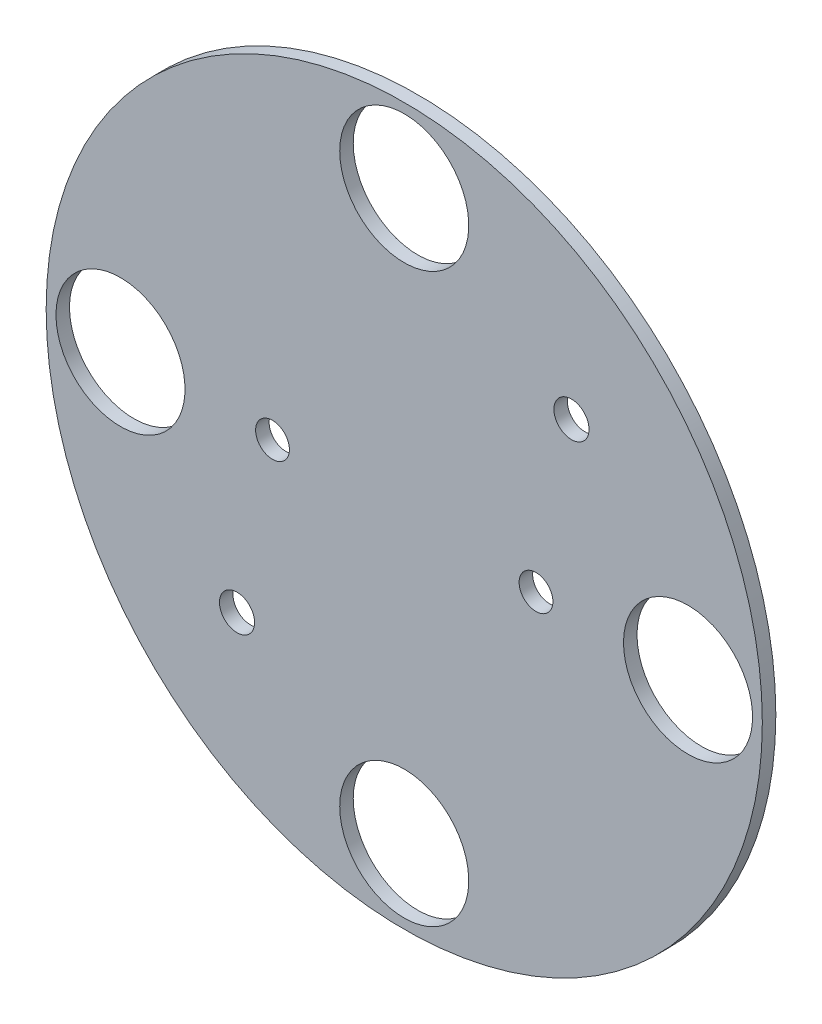
ISO-10303-21;
HEADER;
FILE_DESCRIPTION(('STEP AP214'),'2;1');
FILE_NAME('part.step','',(''),(''),'','','');
FILE_SCHEMA(('AUTOMOTIVE_DESIGN { 1 0 10303 214 1 1 1 1 }'));
ENDSEC;
DATA;
#1=APPLICATION_CONTEXT('core data for automotive mechanical design processes');
#2=APPLICATION_PROTOCOL_DEFINITION('international standard','automotive_design',2000,#1);
#3=PRODUCT_CONTEXT('',#1,'mechanical');
#4=PRODUCT('Part','Part','',(#3));
#5=PRODUCT_RELATED_PRODUCT_CATEGORY('part','',(#4));
#6=PRODUCT_DEFINITION_FORMATION('','',#4);
#7=PRODUCT_DEFINITION_CONTEXT('part definition',#1,'design');
#8=PRODUCT_DEFINITION('design','',#6,#7);
#9=PRODUCT_DEFINITION_SHAPE('','',#8);
#10=(LENGTH_UNIT() NAMED_UNIT(*) SI_UNIT(.MILLI.,.METRE.));
#11=(NAMED_UNIT(*) PLANE_ANGLE_UNIT() SI_UNIT($,.RADIAN.));
#12=(NAMED_UNIT(*) SI_UNIT($,.STERADIAN.) SOLID_ANGLE_UNIT());
#13=UNCERTAINTY_MEASURE_WITH_UNIT(LENGTH_MEASURE(1.E-05),#10,'distance_accuracy_value','');
#14=(GEOMETRIC_REPRESENTATION_CONTEXT(3) GLOBAL_UNCERTAINTY_ASSIGNED_CONTEXT((#13)) GLOBAL_UNIT_ASSIGNED_CONTEXT((#10,
#11,#12)) REPRESENTATION_CONTEXT('',''));
#15=CARTESIAN_POINT('',(0.,0.,0.));
#16=DIRECTION('',(0.,0.,1.));
#17=DIRECTION('',(1.,0.,0.));
#18=AXIS2_PLACEMENT_3D('',#15,#16,#17);
#19=CARTESIAN_POINT('',(-19.5,0.,2.));
#20=DIRECTION('',(0.,0.,-1.));
#21=DIRECTION('',(-1.,0.,0.));
#22=AXIS2_PLACEMENT_3D('',#19,#20,#21);
#23=CYLINDRICAL_SURFACE('',#22,2.5);
#24=CARTESIAN_POINT('',(-19.5,0.,2.));
#25=DIRECTION('',(0.,0.,-1.));
#26=DIRECTION('',(-1.,0.,0.));
#27=AXIS2_PLACEMENT_3D('',#24,#25,#26);
#28=CIRCLE('',#27,2.5);
#29=CARTESIAN_POINT('',(-17.,0.,2.));
#30=VERTEX_POINT('',#29);
#31=EDGE_CURVE('E108',#30,#30,#28,.T.);
#32=ORIENTED_EDGE('',*,*,#31,.F.);
#33=DIRECTION('',(0.,0.,-1.));
#34=VECTOR('',#33,1.);
#35=CARTESIAN_POINT('',(-17.,0.,2.));
#36=LINE('',#35,#34);
#37=CARTESIAN_POINT('',(-17.,0.,0.));
#38=VERTEX_POINT('',#37);
#39=EDGE_CURVE('E11',#30,#38,#36,.T.);
#40=ORIENTED_EDGE('',*,*,#39,.T.);
#41=CARTESIAN_POINT('',(-19.5,0.,0.));
#42=DIRECTION('',(0.,0.,-1.));
#43=DIRECTION('',(-1.,0.,0.));
#44=AXIS2_PLACEMENT_3D('',#41,#42,#43);
#45=CIRCLE('',#44,2.5);
#46=EDGE_CURVE('E137',#38,#38,#45,.T.);
#47=ORIENTED_EDGE('',*,*,#46,.T.);
#48=ORIENTED_EDGE('',*,*,#39,.F.);
#49=EDGE_LOOP('',(#32,#40,#47,#48));
#50=FACE_BOUND('',#49,.T.);
#51=ADVANCED_FACE('F17',(#50),#23,.F.);
#52=CARTESIAN_POINT('',(19.5,0.,2.));
#53=DIRECTION('',(0.,0.,-1.));
#54=DIRECTION('',(-1.,0.,0.));
#55=AXIS2_PLACEMENT_3D('',#52,#53,#54);
#56=CYLINDRICAL_SURFACE('',#55,2.5);
#57=CARTESIAN_POINT('',(19.5,0.,2.));
#58=DIRECTION('',(0.,0.,-1.));
#59=DIRECTION('',(-1.,0.,0.));
#60=AXIS2_PLACEMENT_3D('',#57,#58,#59);
#61=CIRCLE('',#60,2.5);
#62=CARTESIAN_POINT('',(22.,0.,2.));
#63=VERTEX_POINT('',#62);
#64=EDGE_CURVE('E21',#63,#63,#61,.T.);
#65=ORIENTED_EDGE('',*,*,#64,.F.);
#66=DIRECTION('',(0.,0.,-1.));
#67=VECTOR('',#66,1.);
#68=CARTESIAN_POINT('',(22.,0.,2.));
#69=LINE('',#68,#67);
#70=CARTESIAN_POINT('',(22.,0.,0.));
#71=VERTEX_POINT('',#70);
#72=EDGE_CURVE('E28',#63,#71,#69,.T.);
#73=ORIENTED_EDGE('',*,*,#72,.T.);
#74=CARTESIAN_POINT('',(19.5,0.,0.));
#75=DIRECTION('',(0.,0.,-1.));
#76=DIRECTION('',(-1.,0.,0.));
#77=AXIS2_PLACEMENT_3D('',#74,#75,#76);
#78=CIRCLE('',#77,2.5);
#79=EDGE_CURVE('E229',#71,#71,#78,.T.);
#80=ORIENTED_EDGE('',*,*,#79,.T.);
#81=ORIENTED_EDGE('',*,*,#72,.F.);
#82=EDGE_LOOP('',(#65,#73,#80,#81));
#83=FACE_BOUND('',#82,.T.);
#84=ADVANCED_FACE('F167',(#83),#56,.F.);
#85=CARTESIAN_POINT('',(-24.74873734153,-24.74873734153,2.));
#86=DIRECTION('',(0.,0.,-1.));
#87=DIRECTION('',(-1.,0.,0.));
#88=AXIS2_PLACEMENT_3D('',#85,#86,#87);
#89=CYLINDRICAL_SURFACE('',#88,2.6);
#90=CARTESIAN_POINT('',(-24.74873734153,-24.74873734153,2.));
#91=DIRECTION('',(0.,0.,-1.));
#92=DIRECTION('',(-1.,0.,0.));
#93=AXIS2_PLACEMENT_3D('',#90,#91,#92);
#94=CIRCLE('',#93,2.6);
#95=CARTESIAN_POINT('',(-22.14873734153,-24.74873734153,2.));
#96=VERTEX_POINT('',#95);
#97=EDGE_CURVE('E141',#96,#96,#94,.T.);
#98=ORIENTED_EDGE('',*,*,#97,.F.);
#99=DIRECTION('',(0.,0.,-1.));
#100=VECTOR('',#99,1.);
#101=CARTESIAN_POINT('',(-22.14873734153,-24.74873734153,2.));
#102=LINE('',#101,#100);
#103=CARTESIAN_POINT('',(-22.14873734153,-24.74873734153,0.));
#104=VERTEX_POINT('',#103);
#105=EDGE_CURVE('E235',#96,#104,#102,.T.);
#106=ORIENTED_EDGE('',*,*,#105,.T.);
#107=CARTESIAN_POINT('',(-24.74873734153,-24.74873734153,0.));
#108=DIRECTION('',(0.,0.,-1.));
#109=DIRECTION('',(-1.,0.,0.));
#110=AXIS2_PLACEMENT_3D('',#107,#108,#109);
#111=CIRCLE('',#110,2.6);
#112=EDGE_CURVE('E222',#104,#104,#111,.T.);
#113=ORIENTED_EDGE('',*,*,#112,.T.);
#114=ORIENTED_EDGE('',*,*,#105,.F.);
#115=EDGE_LOOP('',(#98,#106,#113,#114));
#116=FACE_BOUND('',#115,.T.);
#117=ADVANCED_FACE('F19',(#116),#89,.F.);
#118=CARTESIAN_POINT('',(24.74873734153,24.74873734153,2.));
#119=DIRECTION('',(0.,0.,-1.));
#120=DIRECTION('',(-1.,0.,0.));
#121=AXIS2_PLACEMENT_3D('',#118,#119,#120);
#122=CYLINDRICAL_SURFACE('',#121,2.6);
#123=CARTESIAN_POINT('',(24.74873734153,24.74873734153,2.));
#124=DIRECTION('',(0.,0.,-1.));
#125=DIRECTION('',(-1.,0.,0.));
#126=AXIS2_PLACEMENT_3D('',#123,#124,#125);
#127=CIRCLE('',#126,2.6);
#128=CARTESIAN_POINT('',(27.34873734153,24.74873734153,2.));
#129=VERTEX_POINT('',#128);
#130=EDGE_CURVE('E126',#129,#129,#127,.T.);
#131=ORIENTED_EDGE('',*,*,#130,.F.);
#132=DIRECTION('',(0.,0.,-1.));
#133=VECTOR('',#132,1.);
#134=CARTESIAN_POINT('',(27.34873734153,24.74873734153,2.));
#135=LINE('',#134,#133);
#136=CARTESIAN_POINT('',(27.34873734153,24.74873734153,0.));
#137=VERTEX_POINT('',#136);
#138=EDGE_CURVE('E197',#129,#137,#135,.T.);
#139=ORIENTED_EDGE('',*,*,#138,.T.);
#140=CARTESIAN_POINT('',(24.74873734153,24.74873734153,0.));
#141=DIRECTION('',(0.,0.,-1.));
#142=DIRECTION('',(-1.,0.,0.));
#143=AXIS2_PLACEMENT_3D('',#140,#141,#142);
#144=CIRCLE('',#143,2.6);
#145=EDGE_CURVE('E219',#137,#137,#144,.T.);
#146=ORIENTED_EDGE('',*,*,#145,.T.);
#147=ORIENTED_EDGE('',*,*,#138,.F.);
#148=EDGE_LOOP('',(#131,#139,#146,#147));
#149=FACE_BOUND('',#148,.T.);
#150=ADVANCED_FACE('F185',(#149),#122,.F.);
#151=CARTESIAN_POINT('',(-42.,0.,0.));
#152=DIRECTION('',(0.,0.,1.));
#153=DIRECTION('',(1.,0.,0.));
#154=AXIS2_PLACEMENT_3D('',#151,#152,#153);
#155=CYLINDRICAL_SURFACE('',#154,9.55);
#156=CARTESIAN_POINT('',(-42.,0.,0.));
#157=DIRECTION('',(0.,0.,-1.));
#158=DIRECTION('',(1.,0.,0.));
#159=AXIS2_PLACEMENT_3D('',#156,#157,#158);
#160=CIRCLE('',#159,9.55);
#161=CARTESIAN_POINT('',(-51.55,0.,0.));
#162=VERTEX_POINT('',#161);
#163=EDGE_CURVE('E120',#162,#162,#160,.T.);
#164=ORIENTED_EDGE('',*,*,#163,.T.);
#165=DIRECTION('',(0.,0.,1.));
#166=VECTOR('',#165,1.);
#167=CARTESIAN_POINT('',(-51.55,0.,0.));
#168=LINE('',#167,#166);
#169=CARTESIAN_POINT('',(-51.55,0.,2.));
#170=VERTEX_POINT('',#169);
#171=EDGE_CURVE('E144',#162,#170,#168,.T.);
#172=ORIENTED_EDGE('',*,*,#171,.T.);
#173=CARTESIAN_POINT('',(-42.,0.,2.));
#174=DIRECTION('',(0.,0.,-1.));
#175=DIRECTION('',(1.,0.,0.));
#176=AXIS2_PLACEMENT_3D('',#173,#174,#175);
#177=CIRCLE('',#176,9.55);
#178=EDGE_CURVE('E122',#170,#170,#177,.T.);
#179=ORIENTED_EDGE('',*,*,#178,.F.);
#180=ORIENTED_EDGE('',*,*,#171,.F.);
#181=EDGE_LOOP('',(#164,#172,#179,#180));
#182=FACE_BOUND('',#181,.T.);
#183=ADVANCED_FACE('F176',(#182),#155,.F.);
#184=CARTESIAN_POINT('',(0.,-42.,0.));
#185=DIRECTION('',(0.,0.,1.));
#186=DIRECTION('',(1.,0.,0.));
#187=AXIS2_PLACEMENT_3D('',#184,#185,#186);
#188=CYLINDRICAL_SURFACE('',#187,9.55);
#189=CARTESIAN_POINT('',(0.,-42.,0.));
#190=DIRECTION('',(0.,0.,-1.));
#191=DIRECTION('',(1.,0.,0.));
#192=AXIS2_PLACEMENT_3D('',#189,#190,#191);
#193=CIRCLE('',#192,9.55);
#194=CARTESIAN_POINT('',(-9.55,-42.,0.));
#195=VERTEX_POINT('',#194);
#196=EDGE_CURVE('E223',#195,#195,#193,.T.);
#197=ORIENTED_EDGE('',*,*,#196,.T.);
#198=DIRECTION('',(0.,0.,1.));
#199=VECTOR('',#198,1.);
#200=CARTESIAN_POINT('',(-9.55,-42.,0.));
#201=LINE('',#200,#199);
#202=CARTESIAN_POINT('',(-9.55,-42.,2.));
#203=VERTEX_POINT('',#202);
#204=EDGE_CURVE('E116',#195,#203,#201,.T.);
#205=ORIENTED_EDGE('',*,*,#204,.T.);
#206=CARTESIAN_POINT('',(0.,-42.,2.));
#207=DIRECTION('',(0.,0.,-1.));
#208=DIRECTION('',(1.,0.,0.));
#209=AXIS2_PLACEMENT_3D('',#206,#207,#208);
#210=CIRCLE('',#209,9.55);
#211=EDGE_CURVE('E127',#203,#203,#210,.T.);
#212=ORIENTED_EDGE('',*,*,#211,.F.);
#213=ORIENTED_EDGE('',*,*,#204,.F.);
#214=EDGE_LOOP('',(#197,#205,#212,#213));
#215=FACE_BOUND('',#214,.T.);
#216=ADVANCED_FACE('F183',(#215),#188,.F.);
#217=CARTESIAN_POINT('',(42.,0.,0.));
#218=DIRECTION('',(0.,0.,1.));
#219=DIRECTION('',(1.,0.,0.));
#220=AXIS2_PLACEMENT_3D('',#217,#218,#219);
#221=CYLINDRICAL_SURFACE('',#220,9.55);
#222=CARTESIAN_POINT('',(42.,0.,0.));
#223=DIRECTION('',(0.,0.,-1.));
#224=DIRECTION('',(1.,0.,0.));
#225=AXIS2_PLACEMENT_3D('',#222,#223,#224);
#226=CIRCLE('',#225,9.55);
#227=CARTESIAN_POINT('',(32.45,0.,0.));
#228=VERTEX_POINT('',#227);
#229=EDGE_CURVE('E129',#228,#228,#226,.T.);
#230=ORIENTED_EDGE('',*,*,#229,.T.);
#231=DIRECTION('',(0.,0.,1.));
#232=VECTOR('',#231,1.);
#233=CARTESIAN_POINT('',(32.45,0.,0.));
#234=LINE('',#233,#232);
#235=CARTESIAN_POINT('',(32.45,0.,2.));
#236=VERTEX_POINT('',#235);
#237=EDGE_CURVE('E107',#228,#236,#234,.T.);
#238=ORIENTED_EDGE('',*,*,#237,.T.);
#239=CARTESIAN_POINT('',(42.,0.,2.));
#240=DIRECTION('',(0.,0.,-1.));
#241=DIRECTION('',(1.,0.,0.));
#242=AXIS2_PLACEMENT_3D('',#239,#240,#241);
#243=CIRCLE('',#242,9.55);
#244=EDGE_CURVE('E208',#236,#236,#243,.T.);
#245=ORIENTED_EDGE('',*,*,#244,.F.);
#246=ORIENTED_EDGE('',*,*,#237,.F.);
#247=EDGE_LOOP('',(#230,#238,#245,#246));
#248=FACE_BOUND('',#247,.T.);
#249=ADVANCED_FACE('F181',(#248),#221,.F.);
#250=CARTESIAN_POINT('',(0.,42.,0.));
#251=DIRECTION('',(0.,0.,1.));
#252=DIRECTION('',(1.,0.,0.));
#253=AXIS2_PLACEMENT_3D('',#250,#251,#252);
#254=CYLINDRICAL_SURFACE('',#253,9.55);
#255=CARTESIAN_POINT('',(0.,42.,0.));
#256=DIRECTION('',(0.,0.,-1.));
#257=DIRECTION('',(1.,0.,0.));
#258=AXIS2_PLACEMENT_3D('',#255,#256,#257);
#259=CIRCLE('',#258,9.55);
#260=CARTESIAN_POINT('',(-9.55,42.,0.));
#261=VERTEX_POINT('',#260);
#262=EDGE_CURVE('E103',#261,#261,#259,.T.);
#263=ORIENTED_EDGE('',*,*,#262,.T.);
#264=DIRECTION('',(0.,0.,1.));
#265=VECTOR('',#264,1.);
#266=CARTESIAN_POINT('',(-9.55,42.,0.));
#267=LINE('',#266,#265);
#268=CARTESIAN_POINT('',(-9.55,42.,2.));
#269=VERTEX_POINT('',#268);
#270=EDGE_CURVE('E100',#261,#269,#267,.T.);
#271=ORIENTED_EDGE('',*,*,#270,.T.);
#272=CARTESIAN_POINT('',(0.,42.,2.));
#273=DIRECTION('',(0.,0.,-1.));
#274=DIRECTION('',(1.,0.,0.));
#275=AXIS2_PLACEMENT_3D('',#272,#273,#274);
#276=CIRCLE('',#275,9.55);
#277=EDGE_CURVE('E105',#269,#269,#276,.T.);
#278=ORIENTED_EDGE('',*,*,#277,.F.);
#279=ORIENTED_EDGE('',*,*,#270,.F.);
#280=EDGE_LOOP('',(#263,#271,#278,#279));
#281=FACE_BOUND('',#280,.T.);
#282=ADVANCED_FACE('F101',(#281),#254,.F.);
#283=CARTESIAN_POINT('',(0.,0.,2.));
#284=DIRECTION('',(0.,0.,1.));
#285=DIRECTION('',(1.,0.,0.));
#286=AXIS2_PLACEMENT_3D('',#283,#284,#285);
#287=PLANE('',#286);
#288=ORIENTED_EDGE('',*,*,#31,.T.);
#289=EDGE_LOOP('',(#288));
#290=FACE_BOUND('',#289,.T.);
#291=ORIENTED_EDGE('',*,*,#64,.T.);
#292=EDGE_LOOP('',(#291));
#293=FACE_BOUND('',#292,.T.);
#294=ORIENTED_EDGE('',*,*,#97,.T.);
#295=EDGE_LOOP('',(#294));
#296=FACE_BOUND('',#295,.T.);
#297=ORIENTED_EDGE('',*,*,#130,.T.);
#298=EDGE_LOOP('',(#297));
#299=FACE_BOUND('',#298,.T.);
#300=ORIENTED_EDGE('',*,*,#178,.T.);
#301=EDGE_LOOP('',(#300));
#302=FACE_BOUND('',#301,.T.);
#303=ORIENTED_EDGE('',*,*,#211,.T.);
#304=EDGE_LOOP('',(#303));
#305=FACE_BOUND('',#304,.T.);
#306=ORIENTED_EDGE('',*,*,#244,.T.);
#307=EDGE_LOOP('',(#306));
#308=FACE_BOUND('',#307,.T.);
#309=ORIENTED_EDGE('',*,*,#277,.T.);
#310=EDGE_LOOP('',(#309));
#311=FACE_BOUND('',#310,.T.);
#312=CARTESIAN_POINT('',(0.,0.,2.));
#313=DIRECTION('',(0.,0.,1.));
#314=DIRECTION('',(1.,0.,0.));
#315=AXIS2_PLACEMENT_3D('',#312,#313,#314);
#316=CIRCLE('',#315,53.);
#317=CARTESIAN_POINT('',(-53.,0.,2.));
#318=VERTEX_POINT('',#317);
#319=EDGE_CURVE('E132',#318,#318,#316,.T.);
#320=ORIENTED_EDGE('',*,*,#319,.T.);
#321=EDGE_LOOP('',(#320));
#322=FACE_BOUND('',#321,.T.);
#323=ADVANCED_FACE('F161',(#290,#293,#296,#299,#302,#305,#308,#311,#322),#287,.T.);
#324=CARTESIAN_POINT('',(0.,0.,0.));
#325=DIRECTION('',(0.,0.,1.));
#326=DIRECTION('',(1.,0.,0.));
#327=AXIS2_PLACEMENT_3D('',#324,#325,#326);
#328=CYLINDRICAL_SURFACE('',#327,53.);
#329=ORIENTED_EDGE('',*,*,#319,.F.);
#330=DIRECTION('',(0.,0.,-1.));
#331=VECTOR('',#330,1.);
#332=CARTESIAN_POINT('',(-53.,0.,0.));
#333=LINE('',#332,#331);
#334=CARTESIAN_POINT('',(-53.,0.,0.));
#335=VERTEX_POINT('',#334);
#336=EDGE_CURVE('E136',#318,#335,#333,.T.);
#337=ORIENTED_EDGE('',*,*,#336,.T.);
#338=CARTESIAN_POINT('',(0.,0.,0.));
#339=DIRECTION('',(0.,0.,1.));
#340=DIRECTION('',(1.,0.,0.));
#341=AXIS2_PLACEMENT_3D('',#338,#339,#340);
#342=CIRCLE('',#341,53.);
#343=EDGE_CURVE('E130',#335,#335,#342,.T.);
#344=ORIENTED_EDGE('',*,*,#343,.T.);
#345=ORIENTED_EDGE('',*,*,#336,.F.);
#346=EDGE_LOOP('',(#329,#337,#344,#345));
#347=FACE_BOUND('',#346,.T.);
#348=ADVANCED_FACE('F152',(#347),#328,.T.);
#349=CARTESIAN_POINT('',(0.,0.,0.));
#350=DIRECTION('',(0.,0.,1.));
#351=DIRECTION('',(1.,0.,0.));
#352=AXIS2_PLACEMENT_3D('',#349,#350,#351);
#353=PLANE('',#352);
#354=ORIENTED_EDGE('',*,*,#46,.F.);
#355=EDGE_LOOP('',(#354));
#356=FACE_BOUND('',#355,.T.);
#357=ORIENTED_EDGE('',*,*,#79,.F.);
#358=EDGE_LOOP('',(#357));
#359=FACE_BOUND('',#358,.T.);
#360=ORIENTED_EDGE('',*,*,#112,.F.);
#361=EDGE_LOOP('',(#360));
#362=FACE_BOUND('',#361,.T.);
#363=ORIENTED_EDGE('',*,*,#145,.F.);
#364=EDGE_LOOP('',(#363));
#365=FACE_BOUND('',#364,.T.);
#366=ORIENTED_EDGE('',*,*,#163,.F.);
#367=EDGE_LOOP('',(#366));
#368=FACE_BOUND('',#367,.T.);
#369=ORIENTED_EDGE('',*,*,#196,.F.);
#370=EDGE_LOOP('',(#369));
#371=FACE_BOUND('',#370,.T.);
#372=ORIENTED_EDGE('',*,*,#229,.F.);
#373=EDGE_LOOP('',(#372));
#374=FACE_BOUND('',#373,.T.);
#375=ORIENTED_EDGE('',*,*,#262,.F.);
#376=EDGE_LOOP('',(#375));
#377=FACE_BOUND('',#376,.T.);
#378=ORIENTED_EDGE('',*,*,#343,.F.);
#379=EDGE_LOOP('',(#378));
#380=FACE_BOUND('',#379,.T.);
#381=ADVANCED_FACE('F154',(#356,#359,#362,#365,#368,#371,#374,#377,#380),#353,.F.);
#382=CLOSED_SHELL('',(#51,#84,#117,#150,#183,#216,#249,#282,#323,#348,#381));
#383=MANIFOLD_SOLID_BREP('B1',#382);
#384=ADVANCED_BREP_SHAPE_REPRESENTATION('',(#18,#383),#14);
#385=SHAPE_DEFINITION_REPRESENTATION(#9,#384);
ENDSEC;
END-ISO-10303-21;
